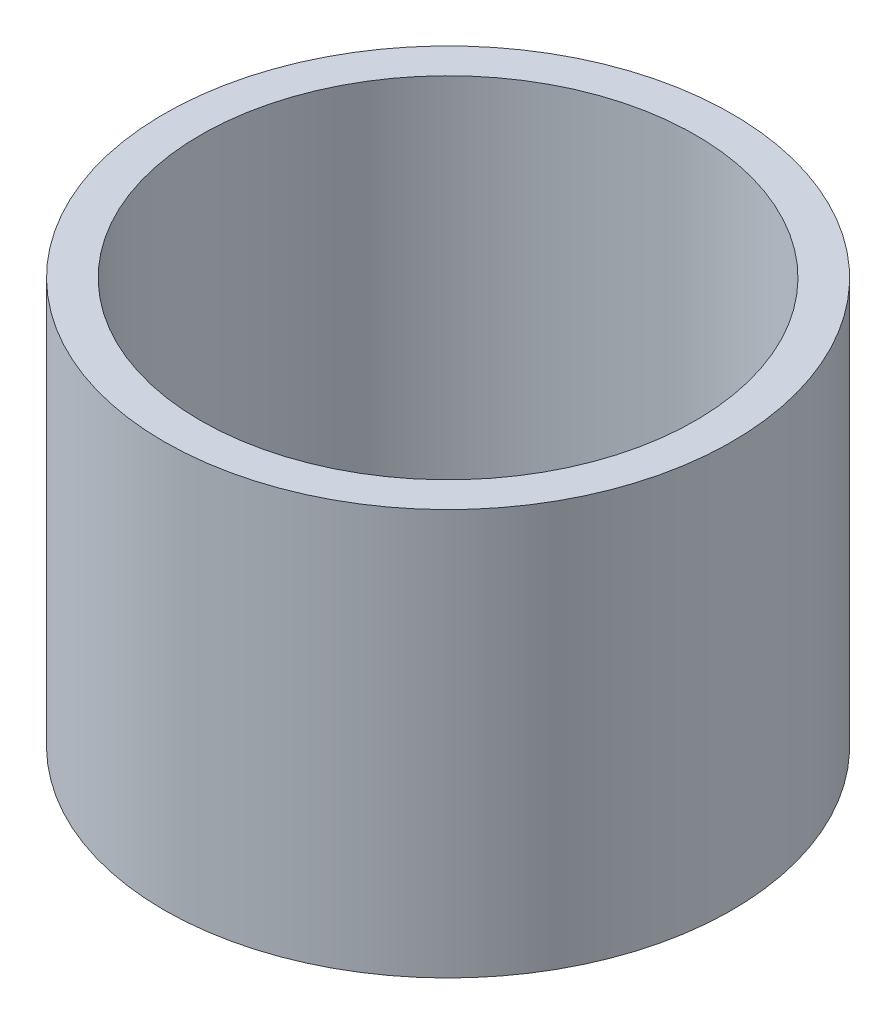
ISO-10303-21;
HEADER;
FILE_DESCRIPTION(('STEP AP214'),'2;1');
FILE_NAME('part.step','',(''),(''),'','','');
FILE_SCHEMA(('AUTOMOTIVE_DESIGN { 1 0 10303 214 1 1 1 1 }'));
ENDSEC;
DATA;
#1=APPLICATION_CONTEXT('core data for automotive mechanical design processes');
#2=APPLICATION_PROTOCOL_DEFINITION('international standard','automotive_design',2000,#1);
#3=PRODUCT_CONTEXT('',#1,'mechanical');
#4=PRODUCT('Part','Part','',(#3));
#5=PRODUCT_RELATED_PRODUCT_CATEGORY('part','',(#4));
#6=PRODUCT_DEFINITION_FORMATION('','',#4);
#7=PRODUCT_DEFINITION_CONTEXT('part definition',#1,'design');
#8=PRODUCT_DEFINITION('design','',#6,#7);
#9=PRODUCT_DEFINITION_SHAPE('','',#8);
#10=(LENGTH_UNIT() NAMED_UNIT(*) SI_UNIT(.MILLI.,.METRE.));
#11=(NAMED_UNIT(*) PLANE_ANGLE_UNIT() SI_UNIT($,.RADIAN.));
#12=(NAMED_UNIT(*) SI_UNIT($,.STERADIAN.) SOLID_ANGLE_UNIT());
#13=UNCERTAINTY_MEASURE_WITH_UNIT(LENGTH_MEASURE(1.E-05),#10,'distance_accuracy_value','');
#14=(GEOMETRIC_REPRESENTATION_CONTEXT(3) GLOBAL_UNCERTAINTY_ASSIGNED_CONTEXT((#13)) GLOBAL_UNIT_ASSIGNED_CONTEXT((#10,
#11,#12)) REPRESENTATION_CONTEXT('',''));
#15=CARTESIAN_POINT('',(0.,0.,0.));
#16=DIRECTION('',(0.,0.,1.));
#17=DIRECTION('',(1.,0.,0.));
#18=AXIS2_PLACEMENT_3D('',#15,#16,#17);
#19=CARTESIAN_POINT('',(0.,5.,0.));
#20=DIRECTION('',(0.,1.,0.));
#21=DIRECTION('',(0.,0.,1.));
#22=AXIS2_PLACEMENT_3D('',#19,#20,#21);
#23=PLANE('',#22);
#24=CARTESIAN_POINT('',(0.,5.,0.));
#25=DIRECTION('',(0.,1.,0.));
#26=DIRECTION('',(0.,0.,1.));
#27=AXIS2_PLACEMENT_3D('',#24,#25,#26);
#28=CIRCLE('',#27,3.5);
#29=CARTESIAN_POINT('',(0.,5.,3.5));
#30=VERTEX_POINT('',#29);
#31=EDGE_CURVE('E10',#30,#30,#28,.T.);
#32=ORIENTED_EDGE('',*,*,#31,.T.);
#33=EDGE_LOOP('',(#32));
#34=FACE_BOUND('',#33,.T.);
#35=CARTESIAN_POINT('',(0.,5.,0.));
#36=DIRECTION('',(0.,1.,0.));
#37=DIRECTION('',(0.,0.,1.));
#38=AXIS2_PLACEMENT_3D('',#35,#36,#37);
#39=CIRCLE('',#38,3.05);
#40=CARTESIAN_POINT('',(0.,5.,3.05));
#41=VERTEX_POINT('',#40);
#42=EDGE_CURVE('E42',#41,#41,#39,.T.);
#43=ORIENTED_EDGE('',*,*,#42,.F.);
#44=EDGE_LOOP('',(#43));
#45=FACE_BOUND('',#44,.T.);
#46=ADVANCED_FACE('F31',(#34,#45),#23,.T.);
#47=CARTESIAN_POINT('',(0.,0.,0.));
#48=DIRECTION('',(0.,1.,0.));
#49=DIRECTION('',(0.,0.,1.));
#50=AXIS2_PLACEMENT_3D('',#47,#48,#49);
#51=PLANE('',#50);
#52=CARTESIAN_POINT('',(0.,0.,0.));
#53=DIRECTION('',(0.,1.,0.));
#54=DIRECTION('',(0.,0.,1.));
#55=AXIS2_PLACEMENT_3D('',#52,#53,#54);
#56=CIRCLE('',#55,3.5);
#57=CARTESIAN_POINT('',(0.,0.,3.5));
#58=VERTEX_POINT('',#57);
#59=EDGE_CURVE('E35',#58,#58,#56,.T.);
#60=ORIENTED_EDGE('',*,*,#59,.F.);
#61=EDGE_LOOP('',(#60));
#62=FACE_BOUND('',#61,.T.);
#63=CARTESIAN_POINT('',(0.,0.,0.));
#64=DIRECTION('',(0.,1.,0.));
#65=DIRECTION('',(0.,0.,1.));
#66=AXIS2_PLACEMENT_3D('',#63,#64,#65);
#67=CIRCLE('',#66,3.05);
#68=CARTESIAN_POINT('',(0.,0.,3.05));
#69=VERTEX_POINT('',#68);
#70=EDGE_CURVE('E44',#69,#69,#67,.T.);
#71=ORIENTED_EDGE('',*,*,#70,.T.);
#72=EDGE_LOOP('',(#71));
#73=FACE_BOUND('',#72,.T.);
#74=ADVANCED_FACE('F54',(#62,#73),#51,.F.);
#75=CARTESIAN_POINT('',(0.,5.,0.));
#76=DIRECTION('',(0.,-1.,0.));
#77=DIRECTION('',(0.,0.,-1.));
#78=AXIS2_PLACEMENT_3D('',#75,#76,#77);
#79=CYLINDRICAL_SURFACE('',#78,3.5);
#80=ORIENTED_EDGE('',*,*,#31,.F.);
#81=EDGE_LOOP('',(#80));
#82=FACE_BOUND('',#81,.T.);
#83=ORIENTED_EDGE('',*,*,#59,.T.);
#84=EDGE_LOOP('',(#83));
#85=FACE_BOUND('',#84,.T.);
#86=ADVANCED_FACE('F33',(#82,#85),#79,.T.);
#87=CARTESIAN_POINT('',(0.,5.,0.));
#88=DIRECTION('',(0.,-1.,0.));
#89=DIRECTION('',(0.,0.,-1.));
#90=AXIS2_PLACEMENT_3D('',#87,#88,#89);
#91=CYLINDRICAL_SURFACE('',#90,3.05);
#92=ORIENTED_EDGE('',*,*,#42,.T.);
#93=EDGE_LOOP('',(#92));
#94=FACE_BOUND('',#93,.T.);
#95=ORIENTED_EDGE('',*,*,#70,.F.);
#96=EDGE_LOOP('',(#95));
#97=FACE_BOUND('',#96,.T.);
#98=ADVANCED_FACE('F50',(#94,#97),#91,.F.);
#99=CLOSED_SHELL('',(#46,#74,#86,#98));
#100=MANIFOLD_SOLID_BREP('B2',#99);
#101=ADVANCED_BREP_SHAPE_REPRESENTATION('',(#18,#100),#14);
#102=SHAPE_DEFINITION_REPRESENTATION(#9,#101);
ENDSEC;
END-ISO-10303-21;
